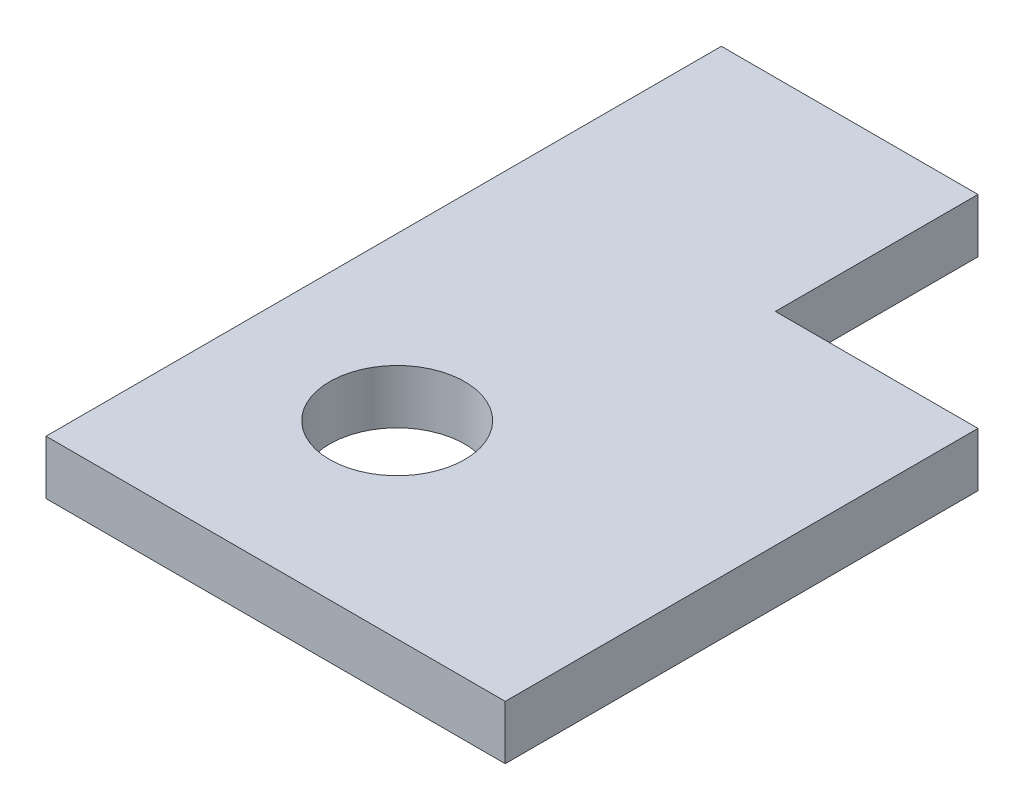
ISO-10303-21;
HEADER;
FILE_DESCRIPTION(('STEP AP214'),'2;1');
FILE_NAME('part.step','',(''),(''),'','','');
FILE_SCHEMA(('AUTOMOTIVE_DESIGN { 1 0 10303 214 1 1 1 1 }'));
ENDSEC;
DATA;
#1=APPLICATION_CONTEXT('core data for automotive mechanical design processes');
#2=APPLICATION_PROTOCOL_DEFINITION('international standard','automotive_design',2000,#1);
#3=PRODUCT_CONTEXT('',#1,'mechanical');
#4=PRODUCT('Part','Part','',(#3));
#5=PRODUCT_RELATED_PRODUCT_CATEGORY('part','',(#4));
#6=PRODUCT_DEFINITION_FORMATION('','',#4);
#7=PRODUCT_DEFINITION_CONTEXT('part definition',#1,'design');
#8=PRODUCT_DEFINITION('design','',#6,#7);
#9=PRODUCT_DEFINITION_SHAPE('','',#8);
#10=(LENGTH_UNIT() NAMED_UNIT(*) SI_UNIT(.MILLI.,.METRE.));
#11=(NAMED_UNIT(*) PLANE_ANGLE_UNIT() SI_UNIT($,.RADIAN.));
#12=(NAMED_UNIT(*) SI_UNIT($,.STERADIAN.) SOLID_ANGLE_UNIT());
#13=UNCERTAINTY_MEASURE_WITH_UNIT(LENGTH_MEASURE(1.E-05),#10,'distance_accuracy_value','');
#14=(GEOMETRIC_REPRESENTATION_CONTEXT(3) GLOBAL_UNCERTAINTY_ASSIGNED_CONTEXT((#13)) GLOBAL_UNIT_ASSIGNED_CONTEXT((#10,
#11,#12)) REPRESENTATION_CONTEXT('',''));
#15=CARTESIAN_POINT('',(0.,0.,0.));
#16=DIRECTION('',(0.,0.,1.));
#17=DIRECTION('',(1.,0.,0.));
#18=AXIS2_PLACEMENT_3D('',#15,#16,#17);
#19=CARTESIAN_POINT('',(0.,4.,0.));
#20=DIRECTION('',(1.,0.,0.));
#21=DIRECTION('',(0.,0.,-1.));
#22=AXIS2_PLACEMENT_3D('',#19,#20,#21);
#23=PLANE('',#22);
#24=DIRECTION('',(0.,0.,1.));
#25=VECTOR('',#24,1.);
#26=CARTESIAN_POINT('',(0.,0.,0.));
#27=LINE('',#26,#25);
#28=CARTESIAN_POINT('',(0.,0.,-50.));
#29=VERTEX_POINT('',#28);
#30=CARTESIAN_POINT('',(0.,0.,0.));
#31=VERTEX_POINT('',#30);
#32=EDGE_CURVE('E117',#29,#31,#27,.T.);
#33=ORIENTED_EDGE('',*,*,#32,.T.);
#34=DIRECTION('',(0.,-1.,0.));
#35=VECTOR('',#34,1.);
#36=CARTESIAN_POINT('',(0.,4.,0.));
#37=LINE('',#36,#35);
#38=CARTESIAN_POINT('',(0.,4.,0.));
#39=VERTEX_POINT('',#38);
#40=EDGE_CURVE('E11',#39,#31,#37,.T.);
#41=ORIENTED_EDGE('',*,*,#40,.F.);
#42=DIRECTION('',(0.,0.,1.));
#43=VECTOR('',#42,1.);
#44=CARTESIAN_POINT('',(0.,4.,0.));
#45=LINE('',#44,#43);
#46=CARTESIAN_POINT('',(0.,4.,-50.));
#47=VERTEX_POINT('',#46);
#48=EDGE_CURVE('E128',#47,#39,#45,.T.);
#49=ORIENTED_EDGE('',*,*,#48,.F.);
#50=DIRECTION('',(0.,-1.,0.));
#51=VECTOR('',#50,1.);
#52=CARTESIAN_POINT('',(0.,4.,-50.));
#53=LINE('',#52,#51);
#54=EDGE_CURVE('E113',#47,#29,#53,.T.);
#55=ORIENTED_EDGE('',*,*,#54,.T.);
#56=EDGE_LOOP('',(#33,#41,#49,#55));
#57=FACE_BOUND('',#56,.T.);
#58=ADVANCED_FACE('F33',(#57),#23,.F.);
#59=CARTESIAN_POINT('',(0.,4.,0.));
#60=DIRECTION('',(0.,0.,-1.));
#61=DIRECTION('',(-1.,0.,0.));
#62=AXIS2_PLACEMENT_3D('',#59,#60,#61);
#63=PLANE('',#62);
#64=DIRECTION('',(1.,0.,0.));
#65=VECTOR('',#64,1.);
#66=CARTESIAN_POINT('',(0.,0.,0.));
#67=LINE('',#66,#65);
#68=CARTESIAN_POINT('',(34.,0.,0.));
#69=VERTEX_POINT('',#68);
#70=EDGE_CURVE('E120',#31,#69,#67,.T.);
#71=ORIENTED_EDGE('',*,*,#70,.T.);
#72=DIRECTION('',(0.,-1.,0.));
#73=VECTOR('',#72,1.);
#74=CARTESIAN_POINT('',(34.,4.,0.));
#75=LINE('',#74,#73);
#76=CARTESIAN_POINT('',(34.,4.,0.));
#77=VERTEX_POINT('',#76);
#78=EDGE_CURVE('E41',#77,#69,#75,.T.);
#79=ORIENTED_EDGE('',*,*,#78,.F.);
#80=DIRECTION('',(1.,0.,0.));
#81=VECTOR('',#80,1.);
#82=CARTESIAN_POINT('',(0.,4.,0.));
#83=LINE('',#82,#81);
#84=EDGE_CURVE('E86',#39,#77,#83,.T.);
#85=ORIENTED_EDGE('',*,*,#84,.F.);
#86=ORIENTED_EDGE('',*,*,#40,.T.);
#87=EDGE_LOOP('',(#71,#79,#85,#86));
#88=FACE_BOUND('',#87,.T.);
#89=ADVANCED_FACE('F153',(#88),#63,.F.);
#90=CARTESIAN_POINT('',(34.,4.,0.));
#91=DIRECTION('',(-1.,0.,0.));
#92=DIRECTION('',(0.,0.,1.));
#93=AXIS2_PLACEMENT_3D('',#90,#91,#92);
#94=PLANE('',#93);
#95=DIRECTION('',(0.,0.,-1.));
#96=VECTOR('',#95,1.);
#97=CARTESIAN_POINT('',(34.,0.,0.));
#98=LINE('',#97,#96);
#99=CARTESIAN_POINT('',(34.,0.,-35.));
#100=VERTEX_POINT('',#99);
#101=EDGE_CURVE('E123',#69,#100,#98,.T.);
#102=ORIENTED_EDGE('',*,*,#101,.T.);
#103=DIRECTION('',(0.,-1.,0.));
#104=VECTOR('',#103,1.);
#105=CARTESIAN_POINT('',(34.,4.,-35.));
#106=LINE('',#105,#104);
#107=CARTESIAN_POINT('',(34.,4.,-35.));
#108=VERTEX_POINT('',#107);
#109=EDGE_CURVE('E108',#108,#100,#106,.T.);
#110=ORIENTED_EDGE('',*,*,#109,.F.);
#111=DIRECTION('',(0.,0.,-1.));
#112=VECTOR('',#111,1.);
#113=CARTESIAN_POINT('',(34.,4.,0.));
#114=LINE('',#113,#112);
#115=EDGE_CURVE('E99',#77,#108,#114,.T.);
#116=ORIENTED_EDGE('',*,*,#115,.F.);
#117=ORIENTED_EDGE('',*,*,#78,.T.);
#118=EDGE_LOOP('',(#102,#110,#116,#117));
#119=FACE_BOUND('',#118,.T.);
#120=ADVANCED_FACE('F134',(#119),#94,.F.);
#121=CARTESIAN_POINT('',(34.,4.,-35.));
#122=DIRECTION('',(0.,0.,1.));
#123=DIRECTION('',(1.,0.,0.));
#124=AXIS2_PLACEMENT_3D('',#121,#122,#123);
#125=PLANE('',#124);
#126=DIRECTION('',(-1.,0.,0.));
#127=VECTOR('',#126,1.);
#128=CARTESIAN_POINT('',(34.,0.,-35.));
#129=LINE('',#128,#127);
#130=CARTESIAN_POINT('',(19.,0.,-35.));
#131=VERTEX_POINT('',#130);
#132=EDGE_CURVE('E107',#100,#131,#129,.T.);
#133=ORIENTED_EDGE('',*,*,#132,.T.);
#134=DIRECTION('',(0.,-1.,0.));
#135=VECTOR('',#134,1.);
#136=CARTESIAN_POINT('',(19.,4.,-35.));
#137=LINE('',#136,#135);
#138=CARTESIAN_POINT('',(19.,4.,-35.));
#139=VERTEX_POINT('',#138);
#140=EDGE_CURVE('E104',#139,#131,#137,.T.);
#141=ORIENTED_EDGE('',*,*,#140,.F.);
#142=DIRECTION('',(-1.,0.,0.));
#143=VECTOR('',#142,1.);
#144=CARTESIAN_POINT('',(34.,4.,-35.));
#145=LINE('',#144,#143);
#146=EDGE_CURVE('E93',#108,#139,#145,.T.);
#147=ORIENTED_EDGE('',*,*,#146,.F.);
#148=ORIENTED_EDGE('',*,*,#109,.T.);
#149=EDGE_LOOP('',(#133,#141,#147,#148));
#150=FACE_BOUND('',#149,.T.);
#151=ADVANCED_FACE('F105',(#150),#125,.F.);
#152=CARTESIAN_POINT('',(19.,4.,-50.));
#153=DIRECTION('',(-1.,0.,0.));
#154=DIRECTION('',(0.,0.,1.));
#155=AXIS2_PLACEMENT_3D('',#152,#153,#154);
#156=PLANE('',#155);
#157=DIRECTION('',(0.,0.,-1.));
#158=VECTOR('',#157,1.);
#159=CARTESIAN_POINT('',(19.,0.,-50.));
#160=LINE('',#159,#158);
#161=CARTESIAN_POINT('',(19.,0.,-50.));
#162=VERTEX_POINT('',#161);
#163=EDGE_CURVE('E72',#131,#162,#160,.T.);
#164=ORIENTED_EDGE('',*,*,#163,.T.);
#165=DIRECTION('',(0.,-1.,0.));
#166=VECTOR('',#165,1.);
#167=CARTESIAN_POINT('',(19.,4.,-50.));
#168=LINE('',#167,#166);
#169=CARTESIAN_POINT('',(19.,4.,-50.));
#170=VERTEX_POINT('',#169);
#171=EDGE_CURVE('E109',#170,#162,#168,.T.);
#172=ORIENTED_EDGE('',*,*,#171,.F.);
#173=DIRECTION('',(0.,0.,-1.));
#174=VECTOR('',#173,1.);
#175=CARTESIAN_POINT('',(19.,4.,-50.));
#176=LINE('',#175,#174);
#177=EDGE_CURVE('E97',#139,#170,#176,.T.);
#178=ORIENTED_EDGE('',*,*,#177,.F.);
#179=ORIENTED_EDGE('',*,*,#140,.T.);
#180=EDGE_LOOP('',(#164,#172,#178,#179));
#181=FACE_BOUND('',#180,.T.);
#182=ADVANCED_FACE('F111',(#181),#156,.F.);
#183=CARTESIAN_POINT('',(0.,4.,-50.));
#184=DIRECTION('',(0.,0.,1.));
#185=DIRECTION('',(1.,0.,0.));
#186=AXIS2_PLACEMENT_3D('',#183,#184,#185);
#187=PLANE('',#186);
#188=DIRECTION('',(-1.,0.,0.));
#189=VECTOR('',#188,1.);
#190=CARTESIAN_POINT('',(0.,0.,-50.));
#191=LINE('',#190,#189);
#192=EDGE_CURVE('E78',#162,#29,#191,.T.);
#193=ORIENTED_EDGE('',*,*,#192,.T.);
#194=ORIENTED_EDGE('',*,*,#54,.F.);
#195=DIRECTION('',(-1.,0.,0.));
#196=VECTOR('',#195,1.);
#197=CARTESIAN_POINT('',(0.,4.,-50.));
#198=LINE('',#197,#196);
#199=EDGE_CURVE('E49',#170,#47,#198,.T.);
#200=ORIENTED_EDGE('',*,*,#199,.F.);
#201=ORIENTED_EDGE('',*,*,#171,.T.);
#202=EDGE_LOOP('',(#193,#194,#200,#201));
#203=FACE_BOUND('',#202,.T.);
#204=ADVANCED_FACE('F141',(#203),#187,.F.);
#205=CARTESIAN_POINT('',(0.,4.,0.));
#206=DIRECTION('',(0.,-1.,0.));
#207=DIRECTION('',(0.,0.,-1.));
#208=AXIS2_PLACEMENT_3D('',#205,#206,#207);
#209=PLANE('',#208);
#210=CARTESIAN_POINT('',(12.,4.,-14.));
#211=DIRECTION('',(0.,1.,0.));
#212=DIRECTION('',(0.,0.,1.));
#213=AXIS2_PLACEMENT_3D('',#210,#211,#212);
#214=CIRCLE('',#213,5.);
#215=CARTESIAN_POINT('',(12.,4.,-9.));
#216=VERTEX_POINT('',#215);
#217=EDGE_CURVE('E208',#216,#216,#214,.T.);
#218=ORIENTED_EDGE('',*,*,#217,.F.);
#219=EDGE_LOOP('',(#218));
#220=FACE_BOUND('',#219,.T.);
#221=ORIENTED_EDGE('',*,*,#48,.T.);
#222=ORIENTED_EDGE('',*,*,#84,.T.);
#223=ORIENTED_EDGE('',*,*,#115,.T.);
#224=ORIENTED_EDGE('',*,*,#146,.T.);
#225=ORIENTED_EDGE('',*,*,#177,.T.);
#226=ORIENTED_EDGE('',*,*,#199,.T.);
#227=EDGE_LOOP('',(#221,#222,#223,#224,#225,#226));
#228=FACE_BOUND('',#227,.T.);
#229=ADVANCED_FACE('F95',(#220,#228),#209,.F.);
#230=CARTESIAN_POINT('',(0.,0.,0.));
#231=DIRECTION('',(0.,-1.,0.));
#232=DIRECTION('',(0.,0.,-1.));
#233=AXIS2_PLACEMENT_3D('',#230,#231,#232);
#234=PLANE('',#233);
#235=CARTESIAN_POINT('',(12.,0.,-14.));
#236=DIRECTION('',(0.,1.,0.));
#237=DIRECTION('',(0.,0.,1.));
#238=AXIS2_PLACEMENT_3D('',#235,#236,#237);
#239=CIRCLE('',#238,5.);
#240=CARTESIAN_POINT('',(12.,0.,-9.));
#241=VERTEX_POINT('',#240);
#242=EDGE_CURVE('E121',#241,#241,#239,.T.);
#243=ORIENTED_EDGE('',*,*,#242,.T.);
#244=EDGE_LOOP('',(#243));
#245=FACE_BOUND('',#244,.T.);
#246=ORIENTED_EDGE('',*,*,#32,.F.);
#247=ORIENTED_EDGE('',*,*,#192,.F.);
#248=ORIENTED_EDGE('',*,*,#163,.F.);
#249=ORIENTED_EDGE('',*,*,#132,.F.);
#250=ORIENTED_EDGE('',*,*,#101,.F.);
#251=ORIENTED_EDGE('',*,*,#70,.F.);
#252=EDGE_LOOP('',(#246,#247,#248,#249,#250,#251));
#253=FACE_BOUND('',#252,.T.);
#254=ADVANCED_FACE('F137',(#245,#253),#234,.T.);
#255=CARTESIAN_POINT('',(12.,0.,-14.));
#256=DIRECTION('',(0.,1.,0.));
#257=DIRECTION('',(0.,0.,1.));
#258=AXIS2_PLACEMENT_3D('',#255,#256,#257);
#259=CYLINDRICAL_SURFACE('',#258,5.);
#260=ORIENTED_EDGE('',*,*,#242,.F.);
#261=EDGE_LOOP('',(#260));
#262=FACE_BOUND('',#261,.T.);
#263=ORIENTED_EDGE('',*,*,#217,.T.);
#264=EDGE_LOOP('',(#263));
#265=FACE_BOUND('',#264,.T.);
#266=ADVANCED_FACE('F190',(#262,#265),#259,.F.);
#267=CLOSED_SHELL('',(#58,#89,#120,#151,#182,#204,#229,#254,#266));
#268=MANIFOLD_SOLID_BREP('B2',#267);
#269=ADVANCED_BREP_SHAPE_REPRESENTATION('',(#18,#268),#14);
#270=SHAPE_DEFINITION_REPRESENTATION(#9,#269);
ENDSEC;
END-ISO-10303-21;
